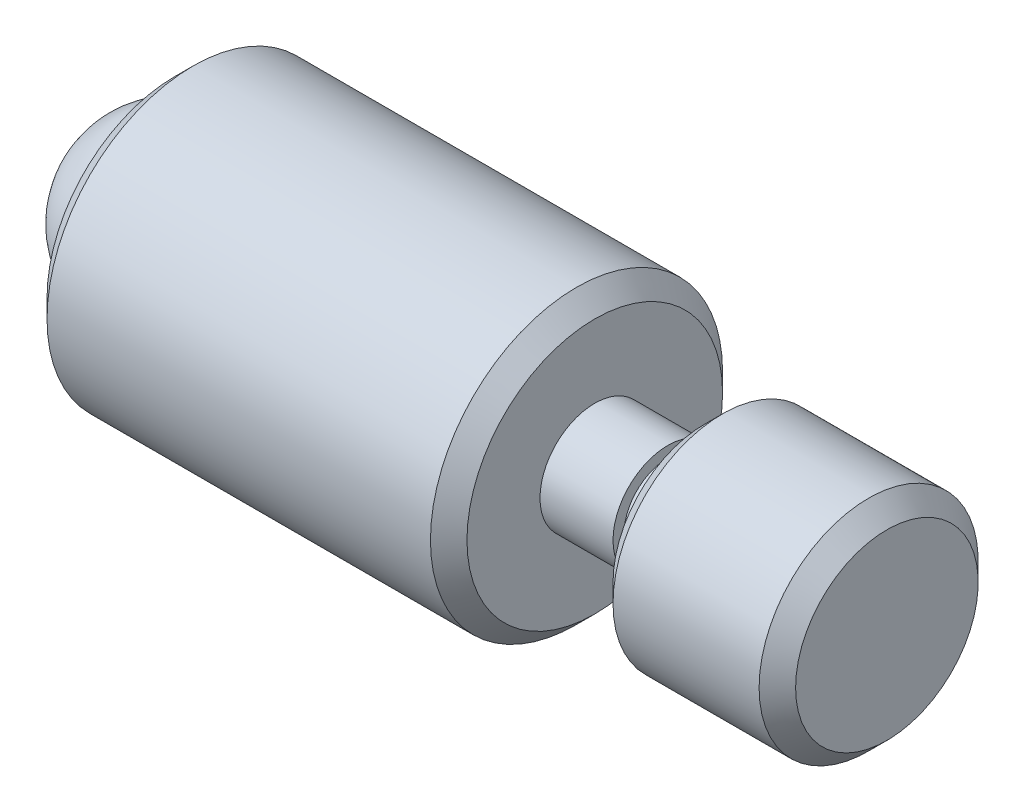
ISO-10303-21;
HEADER;
FILE_DESCRIPTION(('STEP AP214'),'2;1');
FILE_NAME('part.step','',(''),(''),'','','');
FILE_SCHEMA(('AUTOMOTIVE_DESIGN { 1 0 10303 214 1 1 1 1 }'));
ENDSEC;
DATA;
#1=APPLICATION_CONTEXT('core data for automotive mechanical design processes');
#2=APPLICATION_PROTOCOL_DEFINITION('international standard','automotive_design',2000,#1);
#3=PRODUCT_CONTEXT('',#1,'mechanical');
#4=PRODUCT('Part','Part','',(#3));
#5=PRODUCT_RELATED_PRODUCT_CATEGORY('part','',(#4));
#6=PRODUCT_DEFINITION_FORMATION('','',#4);
#7=PRODUCT_DEFINITION_CONTEXT('part definition',#1,'design');
#8=PRODUCT_DEFINITION('design','',#6,#7);
#9=PRODUCT_DEFINITION_SHAPE('','',#8);
#10=(LENGTH_UNIT() NAMED_UNIT(*) SI_UNIT(.MILLI.,.METRE.));
#11=(NAMED_UNIT(*) PLANE_ANGLE_UNIT() SI_UNIT($,.RADIAN.));
#12=(NAMED_UNIT(*) SI_UNIT($,.STERADIAN.) SOLID_ANGLE_UNIT());
#13=UNCERTAINTY_MEASURE_WITH_UNIT(LENGTH_MEASURE(1.E-05),#10,'distance_accuracy_value','');
#14=(GEOMETRIC_REPRESENTATION_CONTEXT(3) GLOBAL_UNCERTAINTY_ASSIGNED_CONTEXT((#13)) GLOBAL_UNIT_ASSIGNED_CONTEXT((#10,
#11,#12)) REPRESENTATION_CONTEXT('',''));
#15=CARTESIAN_POINT('',(0.,0.,0.));
#16=DIRECTION('',(0.,0.,1.));
#17=DIRECTION('',(1.,0.,0.));
#18=AXIS2_PLACEMENT_3D('',#15,#16,#17);
#19=CARTESIAN_POINT('',(2.5,0.,0.));
#20=DIRECTION('',(-1.,0.,0.));
#21=DIRECTION('',(0.,1.,0.));
#22=AXIS2_PLACEMENT_3D('',#19,#20,#21);
#23=SPHERICAL_SURFACE('',#22,2.5);
#24=CARTESIAN_POINT('',(2.5,0.,0.));
#25=DIRECTION('',(-1.,0.,0.));
#26=DIRECTION('',(0.,0.,1.));
#27=AXIS2_PLACEMENT_3D('',#24,#25,#26);
#28=CIRCLE('',#27,2.5);
#29=CARTESIAN_POINT('',(2.5,0.,2.5));
#30=VERTEX_POINT('',#29);
#31=EDGE_CURVE('E10',#30,#30,#28,.T.);
#32=ORIENTED_EDGE('',*,*,#31,.T.);
#33=EDGE_LOOP('',(#32));
#34=FACE_BOUND('',#33,.T.);
#35=ADVANCED_FACE('F31',(#34),#23,.T.);
#36=CARTESIAN_POINT('',(2.5,2.5,0.));
#37=DIRECTION('',(1.,0.,0.));
#38=DIRECTION('',(0.,0.,-1.));
#39=AXIS2_PLACEMENT_3D('',#36,#37,#38);
#40=PLANE('',#39);
#41=ORIENTED_EDGE('',*,*,#31,.F.);
#42=EDGE_LOOP('',(#41));
#43=FACE_BOUND('',#42,.T.);
#44=CARTESIAN_POINT('',(2.5,0.,0.));
#45=DIRECTION('',(-1.,0.,0.));
#46=DIRECTION('',(0.,0.,1.));
#47=AXIS2_PLACEMENT_3D('',#44,#45,#46);
#48=CIRCLE('',#47,3.5);
#49=CARTESIAN_POINT('',(2.5,0.,3.5));
#50=VERTEX_POINT('',#49);
#51=EDGE_CURVE('E37',#50,#50,#48,.T.);
#52=ORIENTED_EDGE('',*,*,#51,.T.);
#53=EDGE_LOOP('',(#52));
#54=FACE_BOUND('',#53,.T.);
#55=ADVANCED_FACE('F90',(#43,#54),#40,.F.);
#56=CARTESIAN_POINT('',(3.,0.,0.));
#57=DIRECTION('',(1.,0.,0.));
#58=DIRECTION('',(0.,0.,-1.));
#59=AXIS2_PLACEMENT_3D('',#56,#57,#58);
#60=CONICAL_SURFACE('',#59,4.,0.785398163397448);
#61=ORIENTED_EDGE('',*,*,#51,.F.);
#62=EDGE_LOOP('',(#61));
#63=FACE_BOUND('',#62,.T.);
#64=CARTESIAN_POINT('',(3.,0.,0.));
#65=DIRECTION('',(-1.,0.,0.));
#66=DIRECTION('',(0.,0.,1.));
#67=AXIS2_PLACEMENT_3D('',#64,#65,#66);
#68=CIRCLE('',#67,4.);
#69=CARTESIAN_POINT('',(3.,0.,4.));
#70=VERTEX_POINT('',#69);
#71=EDGE_CURVE('E41',#70,#70,#68,.T.);
#72=ORIENTED_EDGE('',*,*,#71,.T.);
#73=EDGE_LOOP('',(#72));
#74=FACE_BOUND('',#73,.T.);
#75=ADVANCED_FACE('F94',(#63,#74),#60,.T.);
#76=CARTESIAN_POINT('',(22.,0.,0.));
#77=DIRECTION('',(-1.,0.,0.));
#78=DIRECTION('',(0.,0.,1.));
#79=AXIS2_PLACEMENT_3D('',#76,#77,#78);
#80=CYLINDRICAL_SURFACE('',#79,4.);
#81=ORIENTED_EDGE('',*,*,#71,.F.);
#82=EDGE_LOOP('',(#81));
#83=FACE_BOUND('',#82,.T.);
#84=CARTESIAN_POINT('',(13.5,0.,0.));
#85=DIRECTION('',(-1.,0.,0.));
#86=DIRECTION('',(0.,0.,1.));
#87=AXIS2_PLACEMENT_3D('',#84,#85,#86);
#88=CIRCLE('',#87,4.);
#89=CARTESIAN_POINT('',(13.5,0.,4.));
#90=VERTEX_POINT('',#89);
#91=EDGE_CURVE('E45',#90,#90,#88,.T.);
#92=ORIENTED_EDGE('',*,*,#91,.T.);
#93=EDGE_LOOP('',(#92));
#94=FACE_BOUND('',#93,.T.);
#95=ADVANCED_FACE('F99',(#83,#94),#80,.T.);
#96=CARTESIAN_POINT('',(14.,0.,0.));
#97=DIRECTION('',(-1.,0.,0.));
#98=DIRECTION('',(0.,0.,1.));
#99=AXIS2_PLACEMENT_3D('',#96,#97,#98);
#100=CONICAL_SURFACE('',#99,3.5,0.785398163397448);
#101=ORIENTED_EDGE('',*,*,#91,.F.);
#102=EDGE_LOOP('',(#101));
#103=FACE_BOUND('',#102,.T.);
#104=CARTESIAN_POINT('',(14.,0.,0.));
#105=DIRECTION('',(-1.,0.,0.));
#106=DIRECTION('',(0.,0.,1.));
#107=AXIS2_PLACEMENT_3D('',#104,#105,#106);
#108=CIRCLE('',#107,3.5);
#109=CARTESIAN_POINT('',(14.,0.,3.5));
#110=VERTEX_POINT('',#109);
#111=EDGE_CURVE('E50',#110,#110,#108,.T.);
#112=ORIENTED_EDGE('',*,*,#111,.T.);
#113=EDGE_LOOP('',(#112));
#114=FACE_BOUND('',#113,.T.);
#115=ADVANCED_FACE('F105',(#103,#114),#100,.T.);
#116=CARTESIAN_POINT('',(14.,3.5,0.));
#117=DIRECTION('',(-1.,0.,0.));
#118=DIRECTION('',(0.,0.,1.));
#119=AXIS2_PLACEMENT_3D('',#116,#117,#118);
#120=PLANE('',#119);
#121=ORIENTED_EDGE('',*,*,#111,.F.);
#122=EDGE_LOOP('',(#121));
#123=FACE_BOUND('',#122,.T.);
#124=CARTESIAN_POINT('',(14.,0.,0.));
#125=DIRECTION('',(-1.,0.,0.));
#126=DIRECTION('',(0.,0.,1.));
#127=AXIS2_PLACEMENT_3D('',#124,#125,#126);
#128=CIRCLE('',#127,1.5);
#129=CARTESIAN_POINT('',(14.,0.,1.5));
#130=VERTEX_POINT('',#129);
#131=EDGE_CURVE('E53',#130,#130,#128,.T.);
#132=ORIENTED_EDGE('',*,*,#131,.T.);
#133=EDGE_LOOP('',(#132));
#134=FACE_BOUND('',#133,.T.);
#135=ADVANCED_FACE('F109',(#123,#134),#120,.F.);
#136=CARTESIAN_POINT('',(22.,0.,0.));
#137=DIRECTION('',(-1.,0.,0.));
#138=DIRECTION('',(0.,0.,1.));
#139=AXIS2_PLACEMENT_3D('',#136,#137,#138);
#140=CYLINDRICAL_SURFACE('',#139,1.5);
#141=ORIENTED_EDGE('',*,*,#131,.F.);
#142=EDGE_LOOP('',(#141));
#143=FACE_BOUND('',#142,.T.);
#144=CARTESIAN_POINT('',(16.,0.,0.));
#145=DIRECTION('',(-1.,0.,0.));
#146=DIRECTION('',(0.,0.,1.));
#147=AXIS2_PLACEMENT_3D('',#144,#145,#146);
#148=CIRCLE('',#147,1.5);
#149=CARTESIAN_POINT('',(16.,0.,1.5));
#150=VERTEX_POINT('',#149);
#151=EDGE_CURVE('E56',#150,#150,#148,.T.);
#152=ORIENTED_EDGE('',*,*,#151,.T.);
#153=EDGE_LOOP('',(#152));
#154=FACE_BOUND('',#153,.T.);
#155=ADVANCED_FACE('F113',(#143,#154),#140,.T.);
#156=CARTESIAN_POINT('',(16.,1.5,0.));
#157=DIRECTION('',(-1.,0.,0.));
#158=DIRECTION('',(0.,0.,1.));
#159=AXIS2_PLACEMENT_3D('',#156,#157,#158);
#160=PLANE('',#159);
#161=ORIENTED_EDGE('',*,*,#151,.F.);
#162=EDGE_LOOP('',(#161));
#163=FACE_BOUND('',#162,.T.);
#164=CARTESIAN_POINT('',(16.,0.,0.));
#165=DIRECTION('',(-1.,0.,0.));
#166=DIRECTION('',(0.,0.,1.));
#167=AXIS2_PLACEMENT_3D('',#164,#165,#166);
#168=CIRCLE('',#167,1.2);
#169=CARTESIAN_POINT('',(16.,0.,1.2));
#170=VERTEX_POINT('',#169);
#171=EDGE_CURVE('E59',#170,#170,#168,.T.);
#172=ORIENTED_EDGE('',*,*,#171,.T.);
#173=EDGE_LOOP('',(#172));
#174=FACE_BOUND('',#173,.T.);
#175=ADVANCED_FACE('F117',(#163,#174),#160,.F.);
#176=CARTESIAN_POINT('',(22.,0.,0.));
#177=DIRECTION('',(-1.,0.,0.));
#178=DIRECTION('',(0.,0.,1.));
#179=AXIS2_PLACEMENT_3D('',#176,#177,#178);
#180=CYLINDRICAL_SURFACE('',#179,1.2);
#181=ORIENTED_EDGE('',*,*,#171,.F.);
#182=EDGE_LOOP('',(#181));
#183=FACE_BOUND('',#182,.T.);
#184=CARTESIAN_POINT('',(17.,0.,0.));
#185=DIRECTION('',(-1.,0.,0.));
#186=DIRECTION('',(0.,0.,1.));
#187=AXIS2_PLACEMENT_3D('',#184,#185,#186);
#188=CIRCLE('',#187,1.2);
#189=CARTESIAN_POINT('',(17.,0.,1.2));
#190=VERTEX_POINT('',#189);
#191=EDGE_CURVE('E62',#190,#190,#188,.T.);
#192=ORIENTED_EDGE('',*,*,#191,.T.);
#193=EDGE_LOOP('',(#192));
#194=FACE_BOUND('',#193,.T.);
#195=ADVANCED_FACE('F121',(#183,#194),#180,.T.);
#196=CARTESIAN_POINT('',(17.,1.2,0.));
#197=DIRECTION('',(1.,0.,0.));
#198=DIRECTION('',(0.,0.,-1.));
#199=AXIS2_PLACEMENT_3D('',#196,#197,#198);
#200=PLANE('',#199);
#201=ORIENTED_EDGE('',*,*,#191,.F.);
#202=EDGE_LOOP('',(#201));
#203=FACE_BOUND('',#202,.T.);
#204=CARTESIAN_POINT('',(17.,0.,0.));
#205=DIRECTION('',(-1.,0.,0.));
#206=DIRECTION('',(0.,0.,1.));
#207=AXIS2_PLACEMENT_3D('',#204,#205,#206);
#208=CIRCLE('',#207,2.5);
#209=CARTESIAN_POINT('',(17.,0.,2.5));
#210=VERTEX_POINT('',#209);
#211=EDGE_CURVE('E65',#210,#210,#208,.T.);
#212=ORIENTED_EDGE('',*,*,#211,.T.);
#213=EDGE_LOOP('',(#212));
#214=FACE_BOUND('',#213,.T.);
#215=ADVANCED_FACE('F125',(#203,#214),#200,.F.);
#216=CARTESIAN_POINT('',(17.5,0.,0.));
#217=DIRECTION('',(1.,0.,0.));
#218=DIRECTION('',(0.,0.,-1.));
#219=AXIS2_PLACEMENT_3D('',#216,#217,#218);
#220=CONICAL_SURFACE('',#219,3.,0.785398163397448);
#221=ORIENTED_EDGE('',*,*,#211,.F.);
#222=EDGE_LOOP('',(#221));
#223=FACE_BOUND('',#222,.T.);
#224=CARTESIAN_POINT('',(17.5,0.,0.));
#225=DIRECTION('',(-1.,0.,0.));
#226=DIRECTION('',(0.,0.,1.));
#227=AXIS2_PLACEMENT_3D('',#224,#225,#226);
#228=CIRCLE('',#227,3.);
#229=CARTESIAN_POINT('',(17.5,0.,3.));
#230=VERTEX_POINT('',#229);
#231=EDGE_CURVE('E68',#230,#230,#228,.T.);
#232=ORIENTED_EDGE('',*,*,#231,.T.);
#233=EDGE_LOOP('',(#232));
#234=FACE_BOUND('',#233,.T.);
#235=ADVANCED_FACE('F129',(#223,#234),#220,.T.);
#236=CARTESIAN_POINT('',(22.,0.,0.));
#237=DIRECTION('',(-1.,0.,0.));
#238=DIRECTION('',(0.,0.,1.));
#239=AXIS2_PLACEMENT_3D('',#236,#237,#238);
#240=CYLINDRICAL_SURFACE('',#239,3.);
#241=ORIENTED_EDGE('',*,*,#231,.F.);
#242=EDGE_LOOP('',(#241));
#243=FACE_BOUND('',#242,.T.);
#244=CARTESIAN_POINT('',(21.5,0.,0.));
#245=DIRECTION('',(-1.,0.,0.));
#246=DIRECTION('',(0.,0.,1.));
#247=AXIS2_PLACEMENT_3D('',#244,#245,#246);
#248=CIRCLE('',#247,3.);
#249=CARTESIAN_POINT('',(21.5,0.,3.));
#250=VERTEX_POINT('',#249);
#251=EDGE_CURVE('E71',#250,#250,#248,.T.);
#252=ORIENTED_EDGE('',*,*,#251,.T.);
#253=EDGE_LOOP('',(#252));
#254=FACE_BOUND('',#253,.T.);
#255=ADVANCED_FACE('F86',(#243,#254),#240,.T.);
#256=CARTESIAN_POINT('',(22.,0.,0.));
#257=DIRECTION('',(-1.,0.,0.));
#258=DIRECTION('',(0.,0.,1.));
#259=AXIS2_PLACEMENT_3D('',#256,#257,#258);
#260=CONICAL_SURFACE('',#259,2.5,0.785398163397451);
#261=ORIENTED_EDGE('',*,*,#251,.F.);
#262=EDGE_LOOP('',(#261));
#263=FACE_BOUND('',#262,.T.);
#264=CARTESIAN_POINT('',(22.,0.,0.));
#265=DIRECTION('',(-1.,0.,0.));
#266=DIRECTION('',(0.,0.,1.));
#267=AXIS2_PLACEMENT_3D('',#264,#265,#266);
#268=CIRCLE('',#267,2.5);
#269=CARTESIAN_POINT('',(22.,0.,2.5));
#270=VERTEX_POINT('',#269);
#271=EDGE_CURVE('E74',#270,#270,#268,.T.);
#272=ORIENTED_EDGE('',*,*,#271,.T.);
#273=EDGE_LOOP('',(#272));
#274=FACE_BOUND('',#273,.T.);
#275=ADVANCED_FACE('F78',(#263,#274),#260,.T.);
#276=CARTESIAN_POINT('',(22.,2.5,0.));
#277=DIRECTION('',(-1.,0.,0.));
#278=DIRECTION('',(0.,0.,1.));
#279=AXIS2_PLACEMENT_3D('',#276,#277,#278);
#280=PLANE('',#279);
#281=ORIENTED_EDGE('',*,*,#271,.F.);
#282=EDGE_LOOP('',(#281));
#283=FACE_BOUND('',#282,.T.);
#284=ADVANCED_FACE('F80',(#283),#280,.F.);
#285=CLOSED_SHELL('',(#35,#55,#75,#95,#115,#135,#155,#175,#195,#215,#235,#255,#275,#284));
#286=MANIFOLD_SOLID_BREP('B2',#285);
#287=ADVANCED_BREP_SHAPE_REPRESENTATION('',(#18,#286),#14);
#288=SHAPE_DEFINITION_REPRESENTATION(#9,#287);
ENDSEC;
END-ISO-10303-21;
